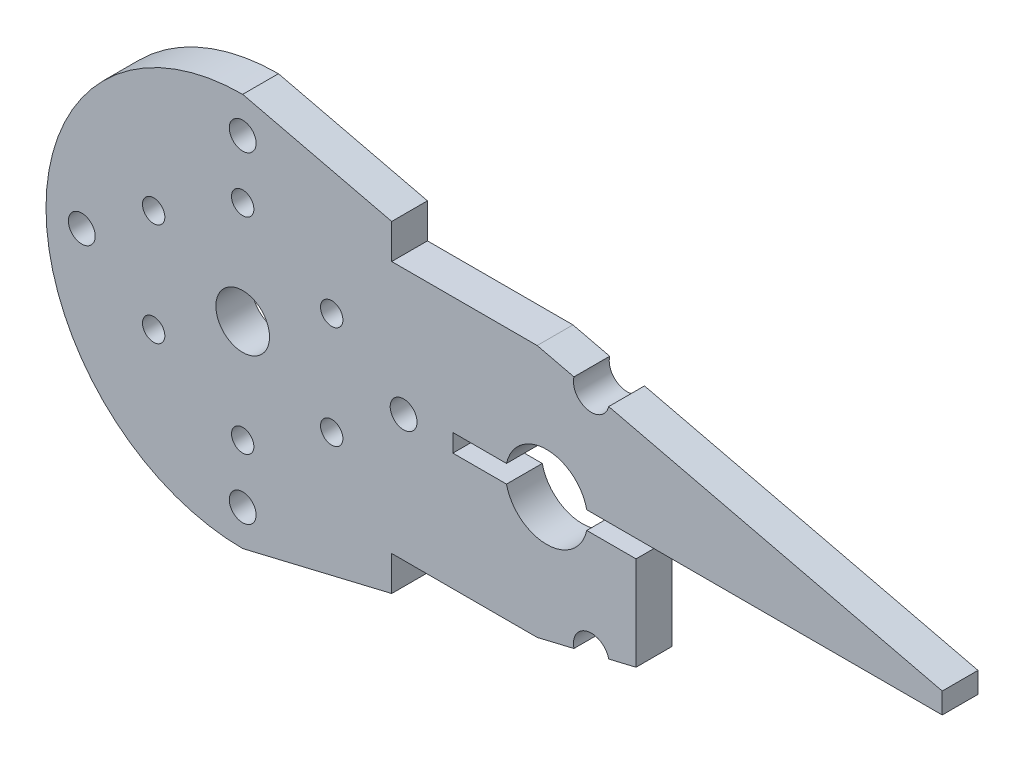
ISO-10303-21;
HEADER;
FILE_DESCRIPTION(('STEP AP214'),'2;1');
FILE_NAME('part.step','',(''),(''),'','','');
FILE_SCHEMA(('AUTOMOTIVE_DESIGN { 1 0 10303 214 1 1 1 1 }'));
ENDSEC;
DATA;
#1=APPLICATION_CONTEXT('core data for automotive mechanical design processes');
#2=APPLICATION_PROTOCOL_DEFINITION('international standard','automotive_design',2000,#1);
#3=PRODUCT_CONTEXT('',#1,'mechanical');
#4=PRODUCT('Part','Part','',(#3));
#5=PRODUCT_RELATED_PRODUCT_CATEGORY('part','',(#4));
#6=PRODUCT_DEFINITION_FORMATION('','',#4);
#7=PRODUCT_DEFINITION_CONTEXT('part definition',#1,'design');
#8=PRODUCT_DEFINITION('design','',#6,#7);
#9=PRODUCT_DEFINITION_SHAPE('','',#8);
#10=(LENGTH_UNIT() NAMED_UNIT(*) SI_UNIT(.MILLI.,.METRE.));
#11=(NAMED_UNIT(*) PLANE_ANGLE_UNIT() SI_UNIT($,.RADIAN.));
#12=(NAMED_UNIT(*) SI_UNIT($,.STERADIAN.) SOLID_ANGLE_UNIT());
#13=UNCERTAINTY_MEASURE_WITH_UNIT(LENGTH_MEASURE(1.E-05),#10,'distance_accuracy_value','');
#14=(GEOMETRIC_REPRESENTATION_CONTEXT(3) GLOBAL_UNCERTAINTY_ASSIGNED_CONTEXT((#13)) GLOBAL_UNIT_ASSIGNED_CONTEXT((#10,
#11,#12)) REPRESENTATION_CONTEXT('',''));
#15=CARTESIAN_POINT('',(0.,0.,0.));
#16=DIRECTION('',(0.,0.,1.));
#17=DIRECTION('',(1.,0.,0.));
#18=AXIS2_PLACEMENT_3D('',#15,#16,#17);
#19=CARTESIAN_POINT('',(5.00100483165142,-11.5010048316527,4.));
#20=DIRECTION('',(-0.232139621887318,0.972682474371782,0.));
#21=DIRECTION('',(-0.972682474371782,-0.232139621887318,0.));
#22=AXIS2_PLACEMENT_3D('',#19,#20,#21);
#23=PLANE('',#22);
#24=DIRECTION('',(0.972682474371782,0.232139621887318,0.));
#25=VECTOR('',#24,1.);
#26=CARTESIAN_POINT('',(5.00100483165142,-11.5010048316527,4.));
#27=LINE('',#26,#25);
#28=CARTESIAN_POINT('',(1.94536494874356,-12.2302614037938,4.));
#29=VERTEX_POINT('',#28);
#30=CARTESIAN_POINT('',(5.00100483165142,-11.5010048316527,4.));
#31=VERTEX_POINT('',#30);
#32=EDGE_CURVE('E299',#29,#31,#27,.T.);
#33=ORIENTED_EDGE('',*,*,#32,.F.);
#34=DIRECTION('',(0.,0.,-1.));
#35=VECTOR('',#34,1.);
#36=CARTESIAN_POINT('',(1.94536494874356,-12.2302614037938,4.));
#37=LINE('',#36,#35);
#38=CARTESIAN_POINT('',(1.94536494874356,-12.2302614037938,0.));
#39=VERTEX_POINT('',#38);
#40=EDGE_CURVE('E11',#29,#39,#37,.T.);
#41=ORIENTED_EDGE('',*,*,#40,.T.);
#42=DIRECTION('',(0.972682474371782,0.232139621887318,0.));
#43=VECTOR('',#42,1.);
#44=CARTESIAN_POINT('',(5.00100483165142,-11.5010048316527,0.));
#45=LINE('',#44,#43);
#46=CARTESIAN_POINT('',(5.00100483165142,-11.5010048316527,0.));
#47=VERTEX_POINT('',#46);
#48=EDGE_CURVE('E329',#39,#47,#45,.T.);
#49=ORIENTED_EDGE('',*,*,#48,.T.);
#50=DIRECTION('',(0.,0.,-1.));
#51=VECTOR('',#50,1.);
#52=CARTESIAN_POINT('',(5.00100483165142,-11.5010048316527,4.));
#53=LINE('',#52,#51);
#54=EDGE_CURVE('E387',#31,#47,#53,.T.);
#55=ORIENTED_EDGE('',*,*,#54,.F.);
#56=EDGE_LOOP('',(#33,#41,#49,#55));
#57=FACE_BOUND('',#56,.T.);
#58=ADVANCED_FACE('F35',(#57),#23,.F.);
#59=CARTESIAN_POINT('',(-6.0565833962178,-14.14,0.));
#60=VERTEX_POINT('',#59);
#61=CARTESIAN_POINT('',(-1.94536494874357,-13.158819891343,0.));
#62=VERTEX_POINT('',#61);
#63=EDGE_CURVE('E334',#60,#62,#45,.T.);
#64=ORIENTED_EDGE('',*,*,#63,.T.);
#65=DIRECTION('',(0.,0.,-1.));
#66=VECTOR('',#65,1.);
#67=CARTESIAN_POINT('',(-1.94536494874357,-13.158819891343,4.));
#68=LINE('',#67,#66);
#69=CARTESIAN_POINT('',(-1.94536494874357,-13.158819891343,4.));
#70=VERTEX_POINT('',#69);
#71=EDGE_CURVE('E43',#62,#70,#68,.F.);
#72=ORIENTED_EDGE('',*,*,#71,.T.);
#73=CARTESIAN_POINT('',(-6.0565833962178,-14.14,4.));
#74=VERTEX_POINT('',#73);
#75=EDGE_CURVE('E303',#74,#70,#27,.T.);
#76=ORIENTED_EDGE('',*,*,#75,.F.);
#77=DIRECTION('',(0.,0.,-1.));
#78=VECTOR('',#77,1.);
#79=CARTESIAN_POINT('',(-6.05658339621781,-14.14,4.));
#80=LINE('',#79,#78);
#81=EDGE_CURVE('E195',#74,#60,#80,.T.);
#82=ORIENTED_EDGE('',*,*,#81,.T.);
#83=EDGE_LOOP('',(#64,#72,#76,#82));
#84=FACE_BOUND('',#83,.T.);
#85=ADVANCED_FACE('F409',(#84),#23,.F.);
#86=CARTESIAN_POINT('',(5.00100483165142,11.5010048316527,4.));
#87=DIRECTION('',(-0.232139621887318,-0.972682474371782,0.));
#88=DIRECTION('',(0.972682474371782,-0.232139621887318,0.));
#89=AXIS2_PLACEMENT_3D('',#86,#87,#88);
#90=PLANE('',#89);
#91=DIRECTION('',(-0.972682474371782,0.232139621887318,0.));
#92=VECTOR('',#91,1.);
#93=CARTESIAN_POINT('',(5.00100483165142,11.5010048316527,4.));
#94=LINE('',#93,#92);
#95=CARTESIAN_POINT('',(-22.3298967373609,18.0237759550532,4.));
#96=VERTEX_POINT('',#95);
#97=CARTESIAN_POINT('',(-38.9989951683486,22.0020096633054,4.));
#98=VERTEX_POINT('',#97);
#99=EDGE_CURVE('E321',#96,#98,#94,.T.);
#100=ORIENTED_EDGE('',*,*,#99,.F.);
#101=DIRECTION('',(0.,0.,-1.));
#102=VECTOR('',#101,1.);
#103=CARTESIAN_POINT('',(-22.3298967373609,18.0237759550532,4.));
#104=LINE('',#103,#102);
#105=CARTESIAN_POINT('',(-22.3298967373609,18.0237759550532,0.));
#106=VERTEX_POINT('',#105);
#107=EDGE_CURVE('E402',#96,#106,#104,.T.);
#108=ORIENTED_EDGE('',*,*,#107,.T.);
#109=DIRECTION('',(-0.972682474371782,0.232139621887318,0.));
#110=VECTOR('',#109,1.);
#111=CARTESIAN_POINT('',(5.00100483165142,11.5010048316527,0.));
#112=LINE('',#111,#110);
#113=CARTESIAN_POINT('',(-38.9989951683486,22.0020096633054,0.));
#114=VERTEX_POINT('',#113);
#115=EDGE_CURVE('E354',#106,#114,#112,.T.);
#116=ORIENTED_EDGE('',*,*,#115,.T.);
#117=DIRECTION('',(0.,0.,-1.));
#118=VECTOR('',#117,1.);
#119=CARTESIAN_POINT('',(-38.9989951683486,22.0020096633054,4.));
#120=LINE('',#119,#118);
#121=EDGE_CURVE('E325',#98,#114,#120,.T.);
#122=ORIENTED_EDGE('',*,*,#121,.F.);
#123=EDGE_LOOP('',(#100,#108,#116,#122));
#124=FACE_BOUND('',#123,.T.);
#125=ADVANCED_FACE('F478',(#124),#90,.F.);
#126=CARTESIAN_POINT('',(-1.94536494874356,13.158819891343,0.));
#127=VERTEX_POINT('',#126);
#128=CARTESIAN_POINT('',(-6.0565833962178,14.14,0.));
#129=VERTEX_POINT('',#128);
#130=EDGE_CURVE('E357',#127,#129,#112,.T.);
#131=ORIENTED_EDGE('',*,*,#130,.T.);
#132=DIRECTION('',(0.,0.,1.));
#133=VECTOR('',#132,1.);
#134=CARTESIAN_POINT('',(-6.05658339621781,14.14,4.));
#135=LINE('',#134,#133);
#136=CARTESIAN_POINT('',(-6.05658339621781,14.14,4.));
#137=VERTEX_POINT('',#136);
#138=EDGE_CURVE('E399',#129,#137,#135,.T.);
#139=ORIENTED_EDGE('',*,*,#138,.T.);
#140=CARTESIAN_POINT('',(-1.94536494874356,13.158819891343,4.));
#141=VERTEX_POINT('',#140);
#142=EDGE_CURVE('E326',#141,#137,#94,.T.);
#143=ORIENTED_EDGE('',*,*,#142,.F.);
#144=DIRECTION('',(0.,0.,-1.));
#145=VECTOR('',#144,1.);
#146=CARTESIAN_POINT('',(-1.94536494874356,13.158819891343,4.));
#147=LINE('',#146,#145);
#148=EDGE_CURVE('E396',#141,#127,#147,.T.);
#149=ORIENTED_EDGE('',*,*,#148,.T.);
#150=EDGE_LOOP('',(#131,#139,#143,#149));
#151=FACE_BOUND('',#150,.T.);
#152=ADVANCED_FACE('F488',(#151),#90,.F.);
#153=CARTESIAN_POINT('',(-38.9989951683486,0.,4.));
#154=DIRECTION('',(0.,0.,1.));
#155=DIRECTION('',(1.,0.,0.));
#156=AXIS2_PLACEMENT_3D('',#153,#154,#155);
#157=PLANE('',#156);
#158=CARTESIAN_POINT('',(0.,-12.6945406475684,4.));
#159=DIRECTION('',(0.,0.,-1.));
#160=DIRECTION('',(-1.,0.,0.));
#161=AXIS2_PLACEMENT_3D('',#158,#159,#160);
#162=CIRCLE('',#161,2.);
#163=EDGE_CURVE('E50',#70,#29,#162,.T.);
#164=ORIENTED_EDGE('',*,*,#163,.T.);
#165=ORIENTED_EDGE('',*,*,#32,.T.);
#166=DIRECTION('',(0.,1.,0.));
#167=VECTOR('',#166,1.);
#168=CARTESIAN_POINT('',(5.00100483165142,-1.,4.));
#169=LINE('',#168,#167);
#170=CARTESIAN_POINT('',(5.00100483165142,-1.,4.));
#171=VERTEX_POINT('',#170);
#172=EDGE_CURVE('E302',#31,#171,#169,.T.);
#173=ORIENTED_EDGE('',*,*,#172,.T.);
#174=DIRECTION('',(-1.,0.,0.));
#175=VECTOR('',#174,1.);
#176=CARTESIAN_POINT('',(5.00100483165142,-1.,4.));
#177=LINE('',#176,#175);
#178=CARTESIAN_POINT('',(-0.509006304219855,-1.,4.));
#179=VERTEX_POINT('',#178);
#180=EDGE_CURVE('E305',#171,#179,#177,.T.);
#181=ORIENTED_EDGE('',*,*,#180,.T.);
#182=CARTESIAN_POINT('',(-4.99899516834858,0.,4.));
#183=DIRECTION('',(0.,0.,-1.));
#184=DIRECTION('',(-1.,0.,0.));
#185=AXIS2_PLACEMENT_3D('',#182,#183,#184);
#186=CIRCLE('',#185,4.6);
#187=CARTESIAN_POINT('',(-9.48898403247731,-1.,4.));
#188=VERTEX_POINT('',#187);
#189=EDGE_CURVE('E307',#179,#188,#186,.T.);
#190=ORIENTED_EDGE('',*,*,#189,.T.);
#191=DIRECTION('',(-1.,0.,0.));
#192=VECTOR('',#191,1.);
#193=CARTESIAN_POINT('',(-15.4889840324773,-1.,4.));
#194=LINE('',#193,#192);
#195=CARTESIAN_POINT('',(-15.4889840324773,-1.,4.));
#196=VERTEX_POINT('',#195);
#197=EDGE_CURVE('E309',#188,#196,#194,.T.);
#198=ORIENTED_EDGE('',*,*,#197,.T.);
#199=DIRECTION('',(0.,1.,0.));
#200=VECTOR('',#199,1.);
#201=CARTESIAN_POINT('',(-15.4889840324773,1.,4.));
#202=LINE('',#201,#200);
#203=CARTESIAN_POINT('',(-15.4889840324773,1.,4.));
#204=VERTEX_POINT('',#203);
#205=EDGE_CURVE('E311',#196,#204,#202,.T.);
#206=ORIENTED_EDGE('',*,*,#205,.T.);
#207=DIRECTION('',(1.,0.,0.));
#208=VECTOR('',#207,1.);
#209=CARTESIAN_POINT('',(-15.4889840324773,1.,4.));
#210=LINE('',#209,#208);
#211=CARTESIAN_POINT('',(-9.48898403247731,1.,4.));
#212=VERTEX_POINT('',#211);
#213=EDGE_CURVE('E313',#204,#212,#210,.T.);
#214=ORIENTED_EDGE('',*,*,#213,.T.);
#215=CARTESIAN_POINT('',(-4.99899516834858,0.,4.));
#216=DIRECTION('',(0.,0.,-1.));
#217=DIRECTION('',(1.,0.,0.));
#218=AXIS2_PLACEMENT_3D('',#215,#216,#217);
#219=CIRCLE('',#218,4.6);
#220=CARTESIAN_POINT('',(-0.509006304219855,1.,4.));
#221=VERTEX_POINT('',#220);
#222=EDGE_CURVE('E315',#212,#221,#219,.T.);
#223=ORIENTED_EDGE('',*,*,#222,.T.);
#224=DIRECTION('',(1.,0.,0.));
#225=VECTOR('',#224,1.);
#226=CARTESIAN_POINT('',(5.00100483165142,1.,4.));
#227=LINE('',#226,#225);
#228=CARTESIAN_POINT('',(39.2548128748764,1.,4.));
#229=VERTEX_POINT('',#228);
#230=EDGE_CURVE('E317',#221,#229,#227,.T.);
#231=ORIENTED_EDGE('',*,*,#230,.T.);
#232=DIRECTION('',(0.,1.,0.));
#233=VECTOR('',#232,1.);
#234=CARTESIAN_POINT('',(39.2548128748764,3.32601838246157,4.));
#235=LINE('',#234,#233);
#236=CARTESIAN_POINT('',(39.2548128748764,3.32601838246157,4.));
#237=VERTEX_POINT('',#236);
#238=EDGE_CURVE('E319',#229,#237,#235,.T.);
#239=ORIENTED_EDGE('',*,*,#238,.T.);
#240=CARTESIAN_POINT('',(1.94536494874357,12.2302614037938,4.));
#241=VERTEX_POINT('',#240);
#242=EDGE_CURVE('E322',#237,#241,#94,.T.);
#243=ORIENTED_EDGE('',*,*,#242,.T.);
#244=CARTESIAN_POINT('',(0.,12.6945406475684,4.));
#245=DIRECTION('',(0.,0.,-1.));
#246=DIRECTION('',(-1.,0.,0.));
#247=AXIS2_PLACEMENT_3D('',#244,#245,#246);
#248=CIRCLE('',#247,2.);
#249=EDGE_CURVE('E226',#241,#141,#248,.T.);
#250=ORIENTED_EDGE('',*,*,#249,.T.);
#251=ORIENTED_EDGE('',*,*,#142,.T.);
#252=DIRECTION('',(-1.,0.,0.));
#253=VECTOR('',#252,1.);
#254=CARTESIAN_POINT('',(-4.11211987717763,14.14,4.));
#255=LINE('',#254,#253);
#256=CARTESIAN_POINT('',(-22.3298967373609,14.14,4.));
#257=VERTEX_POINT('',#256);
#258=EDGE_CURVE('E215',#137,#257,#255,.T.);
#259=ORIENTED_EDGE('',*,*,#258,.T.);
#260=DIRECTION('',(0.,1.,0.));
#261=VECTOR('',#260,1.);
#262=CARTESIAN_POINT('',(-22.3298967373609,14.14,4.));
#263=LINE('',#262,#261);
#264=EDGE_CURVE('E218',#257,#96,#263,.T.);
#265=ORIENTED_EDGE('',*,*,#264,.T.);
#266=ORIENTED_EDGE('',*,*,#99,.T.);
#267=CARTESIAN_POINT('',(-38.9989951683486,0.,4.));
#268=DIRECTION('',(0.,0.,1.));
#269=DIRECTION('',(1.,0.,0.));
#270=AXIS2_PLACEMENT_3D('',#267,#268,#269);
#271=CIRCLE('',#270,22.0020096633054);
#272=CARTESIAN_POINT('',(-38.9989951683486,-22.0020096633054,4.));
#273=VERTEX_POINT('',#272);
#274=EDGE_CURVE('E297',#98,#273,#271,.T.);
#275=ORIENTED_EDGE('',*,*,#274,.T.);
#276=CARTESIAN_POINT('',(-22.3298967373609,-18.0237759550532,4.));
#277=VERTEX_POINT('',#276);
#278=EDGE_CURVE('E204',#273,#277,#27,.T.);
#279=ORIENTED_EDGE('',*,*,#278,.T.);
#280=DIRECTION('',(0.,1.,0.));
#281=VECTOR('',#280,1.);
#282=CARTESIAN_POINT('',(-22.3298967373609,-14.14,4.));
#283=LINE('',#282,#281);
#284=CARTESIAN_POINT('',(-22.3298967373609,-14.14,4.));
#285=VERTEX_POINT('',#284);
#286=EDGE_CURVE('E58',#277,#285,#283,.T.);
#287=ORIENTED_EDGE('',*,*,#286,.T.);
#288=DIRECTION('',(1.,0.,0.));
#289=VECTOR('',#288,1.);
#290=CARTESIAN_POINT('',(-4.11211987717763,-14.14,4.));
#291=LINE('',#290,#289);
#292=EDGE_CURVE('E192',#285,#74,#291,.T.);
#293=ORIENTED_EDGE('',*,*,#292,.T.);
#294=ORIENTED_EDGE('',*,*,#75,.T.);
#295=EDGE_LOOP('',(#164,#165,#173,#181,#190,#198,#206,#214,#223,#231,#239,#243,#250,#251,#259,
#265,#266,#275,#279,#287,#293,#294));
#296=FACE_BOUND('',#295,.T.);
#297=CARTESIAN_POINT('',(-57.001004831654,0.,4.));
#298=DIRECTION('',(0.,0.,1.));
#299=DIRECTION('',(1.,0.,0.));
#300=AXIS2_PLACEMENT_3D('',#297,#298,#299);
#301=CIRCLE('',#300,1.5);
#302=CARTESIAN_POINT('',(-55.501004831654,0.,4.));
#303=VERTEX_POINT('',#302);
#304=EDGE_CURVE('E237',#303,#303,#301,.T.);
#305=ORIENTED_EDGE('',*,*,#304,.F.);
#306=EDGE_LOOP('',(#305));
#307=FACE_BOUND('',#306,.T.);
#308=CARTESIAN_POINT('',(-38.9989951683486,-18.0020096633054,4.));
#309=DIRECTION('',(0.,0.,1.));
#310=DIRECTION('',(1.,0.,0.));
#311=AXIS2_PLACEMENT_3D('',#308,#309,#310);
#312=CIRCLE('',#311,1.5);
#313=CARTESIAN_POINT('',(-37.4989951683486,-18.0020096633054,4.));
#314=VERTEX_POINT('',#313);
#315=EDGE_CURVE('E249',#314,#314,#312,.T.);
#316=ORIENTED_EDGE('',*,*,#315,.F.);
#317=EDGE_LOOP('',(#316));
#318=FACE_BOUND('',#317,.T.);
#319=CARTESIAN_POINT('',(-38.9989951683486,0.,4.));
#320=DIRECTION('',(0.,0.,1.));
#321=DIRECTION('',(1.,0.,0.));
#322=AXIS2_PLACEMENT_3D('',#319,#320,#321);
#323=CIRCLE('',#322,3.);
#324=CARTESIAN_POINT('',(-35.9989951683486,0.,4.));
#325=VERTEX_POINT('',#324);
#326=EDGE_CURVE('E261',#325,#325,#323,.T.);
#327=ORIENTED_EDGE('',*,*,#326,.F.);
#328=EDGE_LOOP('',(#327));
#329=FACE_BOUND('',#328,.T.);
#330=CARTESIAN_POINT('',(-29.0397030248275,5.75000000000001,4.));
#331=DIRECTION('',(0.,0.,1.));
#332=DIRECTION('',(1.,0.,0.));
#333=AXIS2_PLACEMENT_3D('',#330,#331,#332);
#334=CIRCLE('',#333,1.25);
#335=CARTESIAN_POINT('',(-27.7897030248275,5.75000000000001,4.));
#336=VERTEX_POINT('',#335);
#337=EDGE_CURVE('E273',#336,#336,#334,.T.);
#338=ORIENTED_EDGE('',*,*,#337,.F.);
#339=EDGE_LOOP('',(#338));
#340=FACE_BOUND('',#339,.T.);
#341=CARTESIAN_POINT('',(-48.9582873118696,5.75,4.));
#342=DIRECTION('',(0.,0.,1.));
#343=DIRECTION('',(1.,0.,0.));
#344=AXIS2_PLACEMENT_3D('',#341,#342,#343);
#345=CIRCLE('',#344,1.25);
#346=CARTESIAN_POINT('',(-47.7082873118696,5.75,4.));
#347=VERTEX_POINT('',#346);
#348=EDGE_CURVE('E285',#347,#347,#345,.T.);
#349=ORIENTED_EDGE('',*,*,#348,.F.);
#350=EDGE_LOOP('',(#349));
#351=FACE_BOUND('',#350,.T.);
#352=CARTESIAN_POINT('',(-48.9582873118696,-5.75,4.));
#353=DIRECTION('',(0.,0.,1.));
#354=DIRECTION('',(1.,0.,0.));
#355=AXIS2_PLACEMENT_3D('',#352,#353,#354);
#356=CIRCLE('',#355,1.25);
#357=CARTESIAN_POINT('',(-47.7082873118696,-5.75,4.));
#358=VERTEX_POINT('',#357);
#359=EDGE_CURVE('E291',#358,#358,#356,.T.);
#360=ORIENTED_EDGE('',*,*,#359,.F.);
#361=EDGE_LOOP('',(#360));
#362=FACE_BOUND('',#361,.T.);
#363=CARTESIAN_POINT('',(-38.9989951683486,11.5,4.));
#364=DIRECTION('',(0.,0.,1.));
#365=DIRECTION('',(1.,0.,0.));
#366=AXIS2_PLACEMENT_3D('',#363,#364,#365);
#367=CIRCLE('',#366,1.25);
#368=CARTESIAN_POINT('',(-37.7489951683486,11.5,4.));
#369=VERTEX_POINT('',#368);
#370=EDGE_CURVE('E279',#369,#369,#367,.T.);
#371=ORIENTED_EDGE('',*,*,#370,.F.);
#372=EDGE_LOOP('',(#371));
#373=FACE_BOUND('',#372,.T.);
#374=CARTESIAN_POINT('',(-29.0397030248275,-5.75,4.));
#375=DIRECTION('',(0.,0.,1.));
#376=DIRECTION('',(1.,0.,0.));
#377=AXIS2_PLACEMENT_3D('',#374,#375,#376);
#378=CIRCLE('',#377,1.25);
#379=CARTESIAN_POINT('',(-27.7897030248275,-5.75,4.));
#380=VERTEX_POINT('',#379);
#381=EDGE_CURVE('E267',#380,#380,#378,.T.);
#382=ORIENTED_EDGE('',*,*,#381,.F.);
#383=EDGE_LOOP('',(#382));
#384=FACE_BOUND('',#383,.T.);
#385=CARTESIAN_POINT('',(-38.9989951683486,-11.5,4.));
#386=DIRECTION('',(0.,0.,1.));
#387=DIRECTION('',(1.,0.,0.));
#388=AXIS2_PLACEMENT_3D('',#385,#386,#387);
#389=CIRCLE('',#388,1.25);
#390=CARTESIAN_POINT('',(-37.7489951683486,-11.5,4.));
#391=VERTEX_POINT('',#390);
#392=EDGE_CURVE('E255',#391,#391,#389,.T.);
#393=ORIENTED_EDGE('',*,*,#392,.F.);
#394=EDGE_LOOP('',(#393));
#395=FACE_BOUND('',#394,.T.);
#396=CARTESIAN_POINT('',(-38.9989951683486,18.0020096633054,4.));
#397=DIRECTION('',(0.,0.,1.));
#398=DIRECTION('',(1.,0.,0.));
#399=AXIS2_PLACEMENT_3D('',#396,#397,#398);
#400=CIRCLE('',#399,1.5);
#401=CARTESIAN_POINT('',(-37.4989951683486,18.0020096633054,4.));
#402=VERTEX_POINT('',#401);
#403=EDGE_CURVE('E243',#402,#402,#400,.T.);
#404=ORIENTED_EDGE('',*,*,#403,.F.);
#405=EDGE_LOOP('',(#404));
#406=FACE_BOUND('',#405,.T.);
#407=CARTESIAN_POINT('',(-20.9969855050432,0.,4.));
#408=DIRECTION('',(0.,0.,1.));
#409=DIRECTION('',(1.,0.,0.));
#410=AXIS2_PLACEMENT_3D('',#407,#408,#409);
#411=CIRCLE('',#410,1.5);
#412=CARTESIAN_POINT('',(-19.4969855050432,0.,4.));
#413=VERTEX_POINT('',#412);
#414=EDGE_CURVE('E231',#413,#413,#411,.T.);
#415=ORIENTED_EDGE('',*,*,#414,.F.);
#416=EDGE_LOOP('',(#415));
#417=FACE_BOUND('',#416,.T.);
#418=ADVANCED_FACE('F201',(#296,#307,#318,#329,#340,#351,#362,#373,#384,#395,#406,#417),#157,.T.);
#419=CARTESIAN_POINT('',(-38.9989951683486,0.,0.));
#420=DIRECTION('',(0.,0.,1.));
#421=DIRECTION('',(1.,0.,0.));
#422=AXIS2_PLACEMENT_3D('',#419,#420,#421);
#423=PLANE('',#422);
#424=ORIENTED_EDGE('',*,*,#48,.F.);
#425=CARTESIAN_POINT('',(0.,-12.6945406475684,0.));
#426=DIRECTION('',(0.,0.,-1.));
#427=DIRECTION('',(-1.,0.,0.));
#428=AXIS2_PLACEMENT_3D('',#425,#426,#427);
#429=CIRCLE('',#428,2.);
#430=EDGE_CURVE('E212',#62,#39,#429,.T.);
#431=ORIENTED_EDGE('',*,*,#430,.F.);
#432=ORIENTED_EDGE('',*,*,#63,.F.);
#433=DIRECTION('',(1.,0.,0.));
#434=VECTOR('',#433,1.);
#435=CARTESIAN_POINT('',(-4.11211987717763,-14.14,0.));
#436=LINE('',#435,#434);
#437=CARTESIAN_POINT('',(-22.3298967373609,-14.14,0.));
#438=VERTEX_POINT('',#437);
#439=EDGE_CURVE('E207',#438,#60,#436,.T.);
#440=ORIENTED_EDGE('',*,*,#439,.F.);
#441=DIRECTION('',(0.,1.,0.));
#442=VECTOR('',#441,1.);
#443=CARTESIAN_POINT('',(-22.3298967373609,-14.14,0.));
#444=LINE('',#443,#442);
#445=CARTESIAN_POINT('',(-22.3298967373609,-18.0237759550532,0.));
#446=VERTEX_POINT('',#445);
#447=EDGE_CURVE('E186',#446,#438,#444,.T.);
#448=ORIENTED_EDGE('',*,*,#447,.F.);
#449=CARTESIAN_POINT('',(-38.9989951683486,-22.0020096633054,0.));
#450=VERTEX_POINT('',#449);
#451=EDGE_CURVE('E330',#450,#446,#45,.T.);
#452=ORIENTED_EDGE('',*,*,#451,.F.);
#453=CARTESIAN_POINT('',(-38.9989951683486,0.,0.));
#454=DIRECTION('',(0.,0.,1.));
#455=DIRECTION('',(1.,0.,0.));
#456=AXIS2_PLACEMENT_3D('',#453,#454,#455);
#457=CIRCLE('',#456,22.0020096633054);
#458=EDGE_CURVE('E294',#114,#450,#457,.T.);
#459=ORIENTED_EDGE('',*,*,#458,.F.);
#460=ORIENTED_EDGE('',*,*,#115,.F.);
#461=DIRECTION('',(0.,1.,0.));
#462=VECTOR('',#461,1.);
#463=CARTESIAN_POINT('',(-22.3298967373609,14.14,0.));
#464=LINE('',#463,#462);
#465=CARTESIAN_POINT('',(-22.3298967373609,14.14,0.));
#466=VERTEX_POINT('',#465);
#467=EDGE_CURVE('E219',#466,#106,#464,.T.);
#468=ORIENTED_EDGE('',*,*,#467,.F.);
#469=DIRECTION('',(-1.,0.,0.));
#470=VECTOR('',#469,1.);
#471=CARTESIAN_POINT('',(-4.11211987717763,14.14,0.));
#472=LINE('',#471,#470);
#473=EDGE_CURVE('E189',#129,#466,#472,.T.);
#474=ORIENTED_EDGE('',*,*,#473,.F.);
#475=ORIENTED_EDGE('',*,*,#130,.F.);
#476=CARTESIAN_POINT('',(0.,12.6945406475684,0.));
#477=DIRECTION('',(0.,0.,-1.));
#478=DIRECTION('',(-1.,0.,0.));
#479=AXIS2_PLACEMENT_3D('',#476,#477,#478);
#480=CIRCLE('',#479,2.);
#481=CARTESIAN_POINT('',(1.94536494874357,12.2302614037938,0.));
#482=VERTEX_POINT('',#481);
#483=EDGE_CURVE('E211',#482,#127,#480,.T.);
#484=ORIENTED_EDGE('',*,*,#483,.F.);
#485=CARTESIAN_POINT('',(39.2548128748764,3.32601838246157,0.));
#486=VERTEX_POINT('',#485);
#487=EDGE_CURVE('E300',#486,#482,#112,.T.);
#488=ORIENTED_EDGE('',*,*,#487,.F.);
#489=DIRECTION('',(0.,1.,0.));
#490=VECTOR('',#489,1.);
#491=CARTESIAN_POINT('',(39.2548128748764,3.32601838246157,0.));
#492=LINE('',#491,#490);
#493=CARTESIAN_POINT('',(39.2548128748764,1.,0.));
#494=VERTEX_POINT('',#493);
#495=EDGE_CURVE('E351',#494,#486,#492,.T.);
#496=ORIENTED_EDGE('',*,*,#495,.F.);
#497=DIRECTION('',(1.,0.,0.));
#498=VECTOR('',#497,1.);
#499=CARTESIAN_POINT('',(5.00100483165142,1.,0.));
#500=LINE('',#499,#498);
#501=CARTESIAN_POINT('',(-0.509006304219855,1.,0.));
#502=VERTEX_POINT('',#501);
#503=EDGE_CURVE('E349',#502,#494,#500,.T.);
#504=ORIENTED_EDGE('',*,*,#503,.F.);
#505=CARTESIAN_POINT('',(-4.99899516834858,0.,0.));
#506=DIRECTION('',(0.,0.,-1.));
#507=DIRECTION('',(1.,0.,0.));
#508=AXIS2_PLACEMENT_3D('',#505,#506,#507);
#509=CIRCLE('',#508,4.6);
#510=CARTESIAN_POINT('',(-9.48898403247731,1.,0.));
#511=VERTEX_POINT('',#510);
#512=EDGE_CURVE('E346',#511,#502,#509,.T.);
#513=ORIENTED_EDGE('',*,*,#512,.F.);
#514=DIRECTION('',(1.,0.,0.));
#515=VECTOR('',#514,1.);
#516=CARTESIAN_POINT('',(-15.4889840324773,1.,0.));
#517=LINE('',#516,#515);
#518=CARTESIAN_POINT('',(-15.4889840324773,1.,0.));
#519=VERTEX_POINT('',#518);
#520=EDGE_CURVE('E344',#519,#511,#517,.T.);
#521=ORIENTED_EDGE('',*,*,#520,.F.);
#522=DIRECTION('',(0.,1.,0.));
#523=VECTOR('',#522,1.);
#524=CARTESIAN_POINT('',(-15.4889840324773,1.,0.));
#525=LINE('',#524,#523);
#526=CARTESIAN_POINT('',(-15.4889840324773,-1.,0.));
#527=VERTEX_POINT('',#526);
#528=EDGE_CURVE('E342',#527,#519,#525,.T.);
#529=ORIENTED_EDGE('',*,*,#528,.F.);
#530=DIRECTION('',(-1.,0.,0.));
#531=VECTOR('',#530,1.);
#532=CARTESIAN_POINT('',(-15.4889840324773,-1.,0.));
#533=LINE('',#532,#531);
#534=CARTESIAN_POINT('',(-9.48898403247731,-1.,0.));
#535=VERTEX_POINT('',#534);
#536=EDGE_CURVE('E340',#535,#527,#533,.T.);
#537=ORIENTED_EDGE('',*,*,#536,.F.);
#538=CARTESIAN_POINT('',(-4.99899516834858,0.,0.));
#539=DIRECTION('',(0.,0.,-1.));
#540=DIRECTION('',(-1.,0.,0.));
#541=AXIS2_PLACEMENT_3D('',#538,#539,#540);
#542=CIRCLE('',#541,4.6);
#543=CARTESIAN_POINT('',(-0.509006304219855,-1.,0.));
#544=VERTEX_POINT('',#543);
#545=EDGE_CURVE('E338',#544,#535,#542,.T.);
#546=ORIENTED_EDGE('',*,*,#545,.F.);
#547=DIRECTION('',(-1.,0.,0.));
#548=VECTOR('',#547,1.);
#549=CARTESIAN_POINT('',(5.00100483165142,-1.,0.));
#550=LINE('',#549,#548);
#551=CARTESIAN_POINT('',(5.00100483165142,-1.,0.));
#552=VERTEX_POINT('',#551);
#553=EDGE_CURVE('E336',#552,#544,#550,.T.);
#554=ORIENTED_EDGE('',*,*,#553,.F.);
#555=DIRECTION('',(0.,1.,0.));
#556=VECTOR('',#555,1.);
#557=CARTESIAN_POINT('',(5.00100483165142,-1.,0.));
#558=LINE('',#557,#556);
#559=EDGE_CURVE('E333',#47,#552,#558,.T.);
#560=ORIENTED_EDGE('',*,*,#559,.F.);
#561=EDGE_LOOP('',(#424,#431,#432,#440,#448,#452,#459,#460,#468,#474,#475,#484,#488,#496,#504,
#513,#521,#529,#537,#546,#554,#560));
#562=FACE_BOUND('',#561,.T.);
#563=CARTESIAN_POINT('',(-48.9582873118696,-5.75,0.));
#564=DIRECTION('',(0.,0.,1.));
#565=DIRECTION('',(1.,0.,0.));
#566=AXIS2_PLACEMENT_3D('',#563,#564,#565);
#567=CIRCLE('',#566,1.25);
#568=CARTESIAN_POINT('',(-47.7082873118696,-5.75,0.));
#569=VERTEX_POINT('',#568);
#570=EDGE_CURVE('E288',#569,#569,#567,.T.);
#571=ORIENTED_EDGE('',*,*,#570,.T.);
#572=EDGE_LOOP('',(#571));
#573=FACE_BOUND('',#572,.T.);
#574=CARTESIAN_POINT('',(-48.9582873118696,5.75,0.));
#575=DIRECTION('',(0.,0.,1.));
#576=DIRECTION('',(1.,0.,0.));
#577=AXIS2_PLACEMENT_3D('',#574,#575,#576);
#578=CIRCLE('',#577,1.25);
#579=CARTESIAN_POINT('',(-47.7082873118696,5.75,0.));
#580=VERTEX_POINT('',#579);
#581=EDGE_CURVE('E282',#580,#580,#578,.T.);
#582=ORIENTED_EDGE('',*,*,#581,.T.);
#583=EDGE_LOOP('',(#582));
#584=FACE_BOUND('',#583,.T.);
#585=CARTESIAN_POINT('',(-38.9989951683486,11.5,0.));
#586=DIRECTION('',(0.,0.,1.));
#587=DIRECTION('',(1.,0.,0.));
#588=AXIS2_PLACEMENT_3D('',#585,#586,#587);
#589=CIRCLE('',#588,1.25);
#590=CARTESIAN_POINT('',(-37.7489951683486,11.5,0.));
#591=VERTEX_POINT('',#590);
#592=EDGE_CURVE('E276',#591,#591,#589,.T.);
#593=ORIENTED_EDGE('',*,*,#592,.T.);
#594=EDGE_LOOP('',(#593));
#595=FACE_BOUND('',#594,.T.);
#596=CARTESIAN_POINT('',(-29.0397030248275,5.75000000000001,0.));
#597=DIRECTION('',(0.,0.,1.));
#598=DIRECTION('',(1.,0.,0.));
#599=AXIS2_PLACEMENT_3D('',#596,#597,#598);
#600=CIRCLE('',#599,1.25);
#601=CARTESIAN_POINT('',(-27.7897030248275,5.75000000000001,0.));
#602=VERTEX_POINT('',#601);
#603=EDGE_CURVE('E270',#602,#602,#600,.T.);
#604=ORIENTED_EDGE('',*,*,#603,.T.);
#605=EDGE_LOOP('',(#604));
#606=FACE_BOUND('',#605,.T.);
#607=CARTESIAN_POINT('',(-29.0397030248275,-5.75,0.));
#608=DIRECTION('',(0.,0.,1.));
#609=DIRECTION('',(1.,0.,0.));
#610=AXIS2_PLACEMENT_3D('',#607,#608,#609);
#611=CIRCLE('',#610,1.25);
#612=CARTESIAN_POINT('',(-27.7897030248275,-5.75,0.));
#613=VERTEX_POINT('',#612);
#614=EDGE_CURVE('E264',#613,#613,#611,.T.);
#615=ORIENTED_EDGE('',*,*,#614,.T.);
#616=EDGE_LOOP('',(#615));
#617=FACE_BOUND('',#616,.T.);
#618=CARTESIAN_POINT('',(-38.9989951683486,0.,0.));
#619=DIRECTION('',(0.,0.,1.));
#620=DIRECTION('',(1.,0.,0.));
#621=AXIS2_PLACEMENT_3D('',#618,#619,#620);
#622=CIRCLE('',#621,3.);
#623=CARTESIAN_POINT('',(-35.9989951683486,0.,0.));
#624=VERTEX_POINT('',#623);
#625=EDGE_CURVE('E258',#624,#624,#622,.T.);
#626=ORIENTED_EDGE('',*,*,#625,.T.);
#627=EDGE_LOOP('',(#626));
#628=FACE_BOUND('',#627,.T.);
#629=CARTESIAN_POINT('',(-38.9989951683486,-11.5,0.));
#630=DIRECTION('',(0.,0.,1.));
#631=DIRECTION('',(1.,0.,0.));
#632=AXIS2_PLACEMENT_3D('',#629,#630,#631);
#633=CIRCLE('',#632,1.25);
#634=CARTESIAN_POINT('',(-37.7489951683486,-11.5,0.));
#635=VERTEX_POINT('',#634);
#636=EDGE_CURVE('E252',#635,#635,#633,.T.);
#637=ORIENTED_EDGE('',*,*,#636,.T.);
#638=EDGE_LOOP('',(#637));
#639=FACE_BOUND('',#638,.T.);
#640=CARTESIAN_POINT('',(-38.9989951683486,-18.0020096633054,0.));
#641=DIRECTION('',(0.,0.,1.));
#642=DIRECTION('',(1.,0.,0.));
#643=AXIS2_PLACEMENT_3D('',#640,#641,#642);
#644=CIRCLE('',#643,1.5);
#645=CARTESIAN_POINT('',(-37.4989951683486,-18.0020096633054,0.));
#646=VERTEX_POINT('',#645);
#647=EDGE_CURVE('E246',#646,#646,#644,.T.);
#648=ORIENTED_EDGE('',*,*,#647,.T.);
#649=EDGE_LOOP('',(#648));
#650=FACE_BOUND('',#649,.T.);
#651=CARTESIAN_POINT('',(-38.9989951683486,18.0020096633054,0.));
#652=DIRECTION('',(0.,0.,1.));
#653=DIRECTION('',(1.,0.,0.));
#654=AXIS2_PLACEMENT_3D('',#651,#652,#653);
#655=CIRCLE('',#654,1.5);
#656=CARTESIAN_POINT('',(-37.4989951683486,18.0020096633054,0.));
#657=VERTEX_POINT('',#656);
#658=EDGE_CURVE('E240',#657,#657,#655,.T.);
#659=ORIENTED_EDGE('',*,*,#658,.T.);
#660=EDGE_LOOP('',(#659));
#661=FACE_BOUND('',#660,.T.);
#662=CARTESIAN_POINT('',(-57.001004831654,0.,0.));
#663=DIRECTION('',(0.,0.,1.));
#664=DIRECTION('',(1.,0.,0.));
#665=AXIS2_PLACEMENT_3D('',#662,#663,#664);
#666=CIRCLE('',#665,1.5);
#667=CARTESIAN_POINT('',(-55.501004831654,0.,0.));
#668=VERTEX_POINT('',#667);
#669=EDGE_CURVE('E234',#668,#668,#666,.T.);
#670=ORIENTED_EDGE('',*,*,#669,.T.);
#671=EDGE_LOOP('',(#670));
#672=FACE_BOUND('',#671,.T.);
#673=CARTESIAN_POINT('',(-20.9969855050432,0.,0.));
#674=DIRECTION('',(0.,0.,1.));
#675=DIRECTION('',(1.,0.,0.));
#676=AXIS2_PLACEMENT_3D('',#673,#674,#675);
#677=CIRCLE('',#676,1.5);
#678=CARTESIAN_POINT('',(-19.4969855050432,0.,0.));
#679=VERTEX_POINT('',#678);
#680=EDGE_CURVE('E229',#679,#679,#677,.T.);
#681=ORIENTED_EDGE('',*,*,#680,.T.);
#682=EDGE_LOOP('',(#681));
#683=FACE_BOUND('',#682,.T.);
#684=ADVANCED_FACE('F468',(#562,#573,#584,#595,#606,#617,#628,#639,#650,#661,#672,#683),#423,.F.);
#685=CARTESIAN_POINT('',(-38.9989951683486,0.,4.));
#686=DIRECTION('',(0.,0.,-1.));
#687=DIRECTION('',(-1.,0.,0.));
#688=AXIS2_PLACEMENT_3D('',#685,#686,#687);
#689=CYLINDRICAL_SURFACE('',#688,22.0020096633054);
#690=ORIENTED_EDGE('',*,*,#458,.T.);
#691=DIRECTION('',(0.,0.,-1.));
#692=VECTOR('',#691,1.);
#693=CARTESIAN_POINT('',(-38.9989951683486,-22.0020096633054,4.));
#694=LINE('',#693,#692);
#695=EDGE_CURVE('E390',#273,#450,#694,.T.);
#696=ORIENTED_EDGE('',*,*,#695,.F.);
#697=ORIENTED_EDGE('',*,*,#274,.F.);
#698=ORIENTED_EDGE('',*,*,#121,.T.);
#699=EDGE_LOOP('',(#690,#696,#697,#698));
#700=FACE_BOUND('',#699,.T.);
#701=ADVANCED_FACE('F37',(#700),#689,.T.);
#702=ORIENTED_EDGE('',*,*,#451,.T.);
#703=DIRECTION('',(0.,0.,1.));
#704=VECTOR('',#703,1.);
#705=CARTESIAN_POINT('',(-22.3298967373609,-18.0237759550532,4.));
#706=LINE('',#705,#704);
#707=EDGE_CURVE('E405',#446,#277,#706,.T.);
#708=ORIENTED_EDGE('',*,*,#707,.T.);
#709=ORIENTED_EDGE('',*,*,#278,.F.);
#710=ORIENTED_EDGE('',*,*,#695,.T.);
#711=EDGE_LOOP('',(#702,#708,#709,#710));
#712=FACE_BOUND('',#711,.T.);
#713=ADVANCED_FACE('F484',(#712),#23,.F.);
#714=CARTESIAN_POINT('',(5.00100483165142,-1.,4.));
#715=DIRECTION('',(-1.,0.,0.));
#716=DIRECTION('',(0.,0.,1.));
#717=AXIS2_PLACEMENT_3D('',#714,#715,#716);
#718=PLANE('',#717);
#719=ORIENTED_EDGE('',*,*,#559,.T.);
#720=DIRECTION('',(0.,0.,-1.));
#721=VECTOR('',#720,1.);
#722=CARTESIAN_POINT('',(5.00100483165142,-1.,4.));
#723=LINE('',#722,#721);
#724=EDGE_CURVE('E384',#171,#552,#723,.T.);
#725=ORIENTED_EDGE('',*,*,#724,.F.);
#726=ORIENTED_EDGE('',*,*,#172,.F.);
#727=ORIENTED_EDGE('',*,*,#54,.T.);
#728=EDGE_LOOP('',(#719,#725,#726,#727));
#729=FACE_BOUND('',#728,.T.);
#730=ADVANCED_FACE('F420',(#729),#718,.F.);
#731=CARTESIAN_POINT('',(5.00100483165142,-1.,4.));
#732=DIRECTION('',(0.,-1.,0.));
#733=DIRECTION('',(0.,0.,-1.));
#734=AXIS2_PLACEMENT_3D('',#731,#732,#733);
#735=PLANE('',#734);
#736=ORIENTED_EDGE('',*,*,#553,.T.);
#737=DIRECTION('',(0.,0.,-1.));
#738=VECTOR('',#737,1.);
#739=CARTESIAN_POINT('',(-0.509006304219855,-1.,4.));
#740=LINE('',#739,#738);
#741=EDGE_CURVE('E381',#179,#544,#740,.T.);
#742=ORIENTED_EDGE('',*,*,#741,.F.);
#743=ORIENTED_EDGE('',*,*,#180,.F.);
#744=ORIENTED_EDGE('',*,*,#724,.T.);
#745=EDGE_LOOP('',(#736,#742,#743,#744));
#746=FACE_BOUND('',#745,.T.);
#747=ADVANCED_FACE('F425',(#746),#735,.F.);
#748=CARTESIAN_POINT('',(-4.99899516834858,0.,4.));
#749=DIRECTION('',(0.,0.,-1.));
#750=DIRECTION('',(-1.,0.,0.));
#751=AXIS2_PLACEMENT_3D('',#748,#749,#750);
#752=CYLINDRICAL_SURFACE('',#751,4.6);
#753=ORIENTED_EDGE('',*,*,#545,.T.);
#754=DIRECTION('',(0.,0.,-1.));
#755=VECTOR('',#754,1.);
#756=CARTESIAN_POINT('',(-9.48898403247731,-1.,4.));
#757=LINE('',#756,#755);
#758=EDGE_CURVE('E378',#188,#535,#757,.T.);
#759=ORIENTED_EDGE('',*,*,#758,.F.);
#760=ORIENTED_EDGE('',*,*,#189,.F.);
#761=ORIENTED_EDGE('',*,*,#741,.T.);
#762=EDGE_LOOP('',(#753,#759,#760,#761));
#763=FACE_BOUND('',#762,.T.);
#764=ADVANCED_FACE('F431',(#763),#752,.F.);
#765=CARTESIAN_POINT('',(-15.4889840324773,-1.,4.));
#766=DIRECTION('',(0.,-1.,0.));
#767=DIRECTION('',(0.,0.,-1.));
#768=AXIS2_PLACEMENT_3D('',#765,#766,#767);
#769=PLANE('',#768);
#770=ORIENTED_EDGE('',*,*,#536,.T.);
#771=DIRECTION('',(0.,0.,-1.));
#772=VECTOR('',#771,1.);
#773=CARTESIAN_POINT('',(-15.4889840324773,-1.,4.));
#774=LINE('',#773,#772);
#775=EDGE_CURVE('E375',#196,#527,#774,.T.);
#776=ORIENTED_EDGE('',*,*,#775,.F.);
#777=ORIENTED_EDGE('',*,*,#197,.F.);
#778=ORIENTED_EDGE('',*,*,#758,.T.);
#779=EDGE_LOOP('',(#770,#776,#777,#778));
#780=FACE_BOUND('',#779,.T.);
#781=ADVANCED_FACE('F435',(#780),#769,.F.);
#782=CARTESIAN_POINT('',(-15.4889840324773,1.,4.));
#783=DIRECTION('',(-1.,0.,0.));
#784=DIRECTION('',(0.,0.,1.));
#785=AXIS2_PLACEMENT_3D('',#782,#783,#784);
#786=PLANE('',#785);
#787=ORIENTED_EDGE('',*,*,#528,.T.);
#788=DIRECTION('',(0.,0.,-1.));
#789=VECTOR('',#788,1.);
#790=CARTESIAN_POINT('',(-15.4889840324773,1.,4.));
#791=LINE('',#790,#789);
#792=EDGE_CURVE('E372',#204,#519,#791,.T.);
#793=ORIENTED_EDGE('',*,*,#792,.F.);
#794=ORIENTED_EDGE('',*,*,#205,.F.);
#795=ORIENTED_EDGE('',*,*,#775,.T.);
#796=EDGE_LOOP('',(#787,#793,#794,#795));
#797=FACE_BOUND('',#796,.T.);
#798=ADVANCED_FACE('F440',(#797),#786,.F.);
#799=CARTESIAN_POINT('',(-15.4889840324773,1.,4.));
#800=DIRECTION('',(0.,1.,0.));
#801=DIRECTION('',(0.,0.,1.));
#802=AXIS2_PLACEMENT_3D('',#799,#800,#801);
#803=PLANE('',#802);
#804=ORIENTED_EDGE('',*,*,#520,.T.);
#805=DIRECTION('',(0.,0.,-1.));
#806=VECTOR('',#805,1.);
#807=CARTESIAN_POINT('',(-9.48898403247731,1.,4.));
#808=LINE('',#807,#806);
#809=EDGE_CURVE('E369',#212,#511,#808,.T.);
#810=ORIENTED_EDGE('',*,*,#809,.F.);
#811=ORIENTED_EDGE('',*,*,#213,.F.);
#812=ORIENTED_EDGE('',*,*,#792,.T.);
#813=EDGE_LOOP('',(#804,#810,#811,#812));
#814=FACE_BOUND('',#813,.T.);
#815=ADVANCED_FACE('F446',(#814),#803,.F.);
#816=CARTESIAN_POINT('',(-4.99899516834858,0.,4.));
#817=DIRECTION('',(0.,0.,-1.));
#818=DIRECTION('',(-1.,0.,0.));
#819=AXIS2_PLACEMENT_3D('',#816,#817,#818);
#820=CYLINDRICAL_SURFACE('',#819,4.6);
#821=ORIENTED_EDGE('',*,*,#512,.T.);
#822=DIRECTION('',(0.,0.,-1.));
#823=VECTOR('',#822,1.);
#824=CARTESIAN_POINT('',(-0.509006304219855,1.,4.));
#825=LINE('',#824,#823);
#826=EDGE_CURVE('E366',#221,#502,#825,.T.);
#827=ORIENTED_EDGE('',*,*,#826,.F.);
#828=ORIENTED_EDGE('',*,*,#222,.F.);
#829=ORIENTED_EDGE('',*,*,#809,.T.);
#830=EDGE_LOOP('',(#821,#827,#828,#829));
#831=FACE_BOUND('',#830,.T.);
#832=ADVANCED_FACE('F450',(#831),#820,.F.);
#833=CARTESIAN_POINT('',(5.00100483165142,1.,4.));
#834=DIRECTION('',(0.,1.,0.));
#835=DIRECTION('',(0.,0.,1.));
#836=AXIS2_PLACEMENT_3D('',#833,#834,#835);
#837=PLANE('',#836);
#838=ORIENTED_EDGE('',*,*,#503,.T.);
#839=DIRECTION('',(0.,0.,-1.));
#840=VECTOR('',#839,1.);
#841=CARTESIAN_POINT('',(39.2548128748764,1.,4.));
#842=LINE('',#841,#840);
#843=EDGE_CURVE('E363',#229,#494,#842,.T.);
#844=ORIENTED_EDGE('',*,*,#843,.F.);
#845=ORIENTED_EDGE('',*,*,#230,.F.);
#846=ORIENTED_EDGE('',*,*,#826,.T.);
#847=EDGE_LOOP('',(#838,#844,#845,#846));
#848=FACE_BOUND('',#847,.T.);
#849=ADVANCED_FACE('F454',(#848),#837,.F.);
#850=CARTESIAN_POINT('',(39.2548128748764,3.32601838246157,4.));
#851=DIRECTION('',(-1.,0.,0.));
#852=DIRECTION('',(0.,0.,1.));
#853=AXIS2_PLACEMENT_3D('',#850,#851,#852);
#854=PLANE('',#853);
#855=ORIENTED_EDGE('',*,*,#495,.T.);
#856=DIRECTION('',(0.,0.,-1.));
#857=VECTOR('',#856,1.);
#858=CARTESIAN_POINT('',(39.2548128748764,3.32601838246157,4.));
#859=LINE('',#858,#857);
#860=EDGE_CURVE('E360',#237,#486,#859,.T.);
#861=ORIENTED_EDGE('',*,*,#860,.F.);
#862=ORIENTED_EDGE('',*,*,#238,.F.);
#863=ORIENTED_EDGE('',*,*,#843,.T.);
#864=EDGE_LOOP('',(#855,#861,#862,#863));
#865=FACE_BOUND('',#864,.T.);
#866=ADVANCED_FACE('F459',(#865),#854,.F.);
#867=ORIENTED_EDGE('',*,*,#487,.T.);
#868=DIRECTION('',(0.,0.,-1.));
#869=VECTOR('',#868,1.);
#870=CARTESIAN_POINT('',(1.94536494874357,12.2302614037938,4.));
#871=LINE('',#870,#869);
#872=EDGE_CURVE('E393',#482,#241,#871,.F.);
#873=ORIENTED_EDGE('',*,*,#872,.T.);
#874=ORIENTED_EDGE('',*,*,#242,.F.);
#875=ORIENTED_EDGE('',*,*,#860,.T.);
#876=EDGE_LOOP('',(#867,#873,#874,#875));
#877=FACE_BOUND('',#876,.T.);
#878=ADVANCED_FACE('F462',(#877),#90,.F.);
#879=CARTESIAN_POINT('',(-48.9582873118696,-5.75,4.));
#880=DIRECTION('',(0.,0.,-1.));
#881=DIRECTION('',(-1.,0.,0.));
#882=AXIS2_PLACEMENT_3D('',#879,#880,#881);
#883=CYLINDRICAL_SURFACE('',#882,1.25);
#884=ORIENTED_EDGE('',*,*,#359,.T.);
#885=EDGE_LOOP('',(#884));
#886=FACE_BOUND('',#885,.T.);
#887=ORIENTED_EDGE('',*,*,#570,.F.);
#888=EDGE_LOOP('',(#887));
#889=FACE_BOUND('',#888,.T.);
#890=ADVANCED_FACE('F525',(#886,#889),#883,.F.);
#891=CARTESIAN_POINT('',(-48.9582873118696,5.75,4.));
#892=DIRECTION('',(0.,0.,-1.));
#893=DIRECTION('',(-1.,0.,0.));
#894=AXIS2_PLACEMENT_3D('',#891,#892,#893);
#895=CYLINDRICAL_SURFACE('',#894,1.25);
#896=ORIENTED_EDGE('',*,*,#348,.T.);
#897=EDGE_LOOP('',(#896));
#898=FACE_BOUND('',#897,.T.);
#899=ORIENTED_EDGE('',*,*,#581,.F.);
#900=EDGE_LOOP('',(#899));
#901=FACE_BOUND('',#900,.T.);
#902=ADVANCED_FACE('F584',(#898,#901),#895,.F.);
#903=CARTESIAN_POINT('',(-38.9989951683486,11.5,4.));
#904=DIRECTION('',(0.,0.,-1.));
#905=DIRECTION('',(-1.,0.,0.));
#906=AXIS2_PLACEMENT_3D('',#903,#904,#905);
#907=CYLINDRICAL_SURFACE('',#906,1.25);
#908=ORIENTED_EDGE('',*,*,#370,.T.);
#909=EDGE_LOOP('',(#908));
#910=FACE_BOUND('',#909,.T.);
#911=ORIENTED_EDGE('',*,*,#592,.F.);
#912=EDGE_LOOP('',(#911));
#913=FACE_BOUND('',#912,.T.);
#914=ADVANCED_FACE('F591',(#910,#913),#907,.F.);
#915=CARTESIAN_POINT('',(-29.0397030248275,5.75000000000001,4.));
#916=DIRECTION('',(0.,0.,-1.));
#917=DIRECTION('',(-1.,0.,0.));
#918=AXIS2_PLACEMENT_3D('',#915,#916,#917);
#919=CYLINDRICAL_SURFACE('',#918,1.25);
#920=ORIENTED_EDGE('',*,*,#337,.T.);
#921=EDGE_LOOP('',(#920));
#922=FACE_BOUND('',#921,.T.);
#923=ORIENTED_EDGE('',*,*,#603,.F.);
#924=EDGE_LOOP('',(#923));
#925=FACE_BOUND('',#924,.T.);
#926=ADVANCED_FACE('F599',(#922,#925),#919,.F.);
#927=CARTESIAN_POINT('',(-29.0397030248275,-5.75,4.));
#928=DIRECTION('',(0.,0.,-1.));
#929=DIRECTION('',(-1.,0.,0.));
#930=AXIS2_PLACEMENT_3D('',#927,#928,#929);
#931=CYLINDRICAL_SURFACE('',#930,1.25);
#932=ORIENTED_EDGE('',*,*,#381,.T.);
#933=EDGE_LOOP('',(#932));
#934=FACE_BOUND('',#933,.T.);
#935=ORIENTED_EDGE('',*,*,#614,.F.);
#936=EDGE_LOOP('',(#935));
#937=FACE_BOUND('',#936,.T.);
#938=ADVANCED_FACE('F607',(#934,#937),#931,.F.);
#939=CARTESIAN_POINT('',(-38.9989951683486,0.,4.));
#940=DIRECTION('',(0.,0.,-1.));
#941=DIRECTION('',(-1.,0.,0.));
#942=AXIS2_PLACEMENT_3D('',#939,#940,#941);
#943=CYLINDRICAL_SURFACE('',#942,3.);
#944=ORIENTED_EDGE('',*,*,#326,.T.);
#945=EDGE_LOOP('',(#944));
#946=FACE_BOUND('',#945,.T.);
#947=ORIENTED_EDGE('',*,*,#625,.F.);
#948=EDGE_LOOP('',(#947));
#949=FACE_BOUND('',#948,.T.);
#950=ADVANCED_FACE('F615',(#946,#949),#943,.F.);
#951=CARTESIAN_POINT('',(-38.9989951683486,-11.5,4.));
#952=DIRECTION('',(0.,0.,-1.));
#953=DIRECTION('',(-1.,0.,0.));
#954=AXIS2_PLACEMENT_3D('',#951,#952,#953);
#955=CYLINDRICAL_SURFACE('',#954,1.25);
#956=ORIENTED_EDGE('',*,*,#392,.T.);
#957=EDGE_LOOP('',(#956));
#958=FACE_BOUND('',#957,.T.);
#959=ORIENTED_EDGE('',*,*,#636,.F.);
#960=EDGE_LOOP('',(#959));
#961=FACE_BOUND('',#960,.T.);
#962=ADVANCED_FACE('F623',(#958,#961),#955,.F.);
#963=CARTESIAN_POINT('',(-38.9989951683486,-18.0020096633054,4.));
#964=DIRECTION('',(0.,0.,-1.));
#965=DIRECTION('',(-1.,0.,0.));
#966=AXIS2_PLACEMENT_3D('',#963,#964,#965);
#967=CYLINDRICAL_SURFACE('',#966,1.5);
#968=ORIENTED_EDGE('',*,*,#315,.T.);
#969=EDGE_LOOP('',(#968));
#970=FACE_BOUND('',#969,.T.);
#971=ORIENTED_EDGE('',*,*,#647,.F.);
#972=EDGE_LOOP('',(#971));
#973=FACE_BOUND('',#972,.T.);
#974=ADVANCED_FACE('F631',(#970,#973),#967,.F.);
#975=CARTESIAN_POINT('',(-38.9989951683486,18.0020096633054,4.));
#976=DIRECTION('',(0.,0.,-1.));
#977=DIRECTION('',(-1.,0.,0.));
#978=AXIS2_PLACEMENT_3D('',#975,#976,#977);
#979=CYLINDRICAL_SURFACE('',#978,1.5);
#980=ORIENTED_EDGE('',*,*,#403,.T.);
#981=EDGE_LOOP('',(#980));
#982=FACE_BOUND('',#981,.T.);
#983=ORIENTED_EDGE('',*,*,#658,.F.);
#984=EDGE_LOOP('',(#983));
#985=FACE_BOUND('',#984,.T.);
#986=ADVANCED_FACE('F639',(#982,#985),#979,.F.);
#987=CARTESIAN_POINT('',(-57.001004831654,0.,4.));
#988=DIRECTION('',(0.,0.,-1.));
#989=DIRECTION('',(-1.,0.,0.));
#990=AXIS2_PLACEMENT_3D('',#987,#988,#989);
#991=CYLINDRICAL_SURFACE('',#990,1.5);
#992=ORIENTED_EDGE('',*,*,#304,.T.);
#993=EDGE_LOOP('',(#992));
#994=FACE_BOUND('',#993,.T.);
#995=ORIENTED_EDGE('',*,*,#669,.F.);
#996=EDGE_LOOP('',(#995));
#997=FACE_BOUND('',#996,.T.);
#998=ADVANCED_FACE('F647',(#994,#997),#991,.F.);
#999=CARTESIAN_POINT('',(-20.9969855050432,0.,4.));
#1000=DIRECTION('',(0.,0.,-1.));
#1001=DIRECTION('',(-1.,0.,0.));
#1002=AXIS2_PLACEMENT_3D('',#999,#1000,#1001);
#1003=CYLINDRICAL_SURFACE('',#1002,1.5);
#1004=ORIENTED_EDGE('',*,*,#414,.T.);
#1005=EDGE_LOOP('',(#1004));
#1006=FACE_BOUND('',#1005,.T.);
#1007=ORIENTED_EDGE('',*,*,#680,.F.);
#1008=EDGE_LOOP('',(#1007));
#1009=FACE_BOUND('',#1008,.T.);
#1010=ADVANCED_FACE('F500',(#1006,#1009),#1003,.F.);
#1011=CARTESIAN_POINT('',(0.,12.6945406475684,4.));
#1012=DIRECTION('',(0.,0.,-1.));
#1013=DIRECTION('',(-1.,0.,0.));
#1014=AXIS2_PLACEMENT_3D('',#1011,#1012,#1013);
#1015=CYLINDRICAL_SURFACE('',#1014,2.);
#1016=ORIENTED_EDGE('',*,*,#249,.F.);
#1017=ORIENTED_EDGE('',*,*,#872,.F.);
#1018=ORIENTED_EDGE('',*,*,#483,.T.);
#1019=ORIENTED_EDGE('',*,*,#148,.F.);
#1020=EDGE_LOOP('',(#1016,#1017,#1018,#1019));
#1021=FACE_BOUND('',#1020,.T.);
#1022=ADVANCED_FACE('F465',(#1021),#1015,.F.);
#1023=CARTESIAN_POINT('',(-22.3298967373609,14.14,4.));
#1024=DIRECTION('',(-1.,0.,0.));
#1025=DIRECTION('',(0.,0.,1.));
#1026=AXIS2_PLACEMENT_3D('',#1023,#1024,#1025);
#1027=PLANE('',#1026);
#1028=ORIENTED_EDGE('',*,*,#264,.F.);
#1029=DIRECTION('',(0.,0.,-1.));
#1030=VECTOR('',#1029,1.);
#1031=CARTESIAN_POINT('',(-22.3298967373609,14.14,4.));
#1032=LINE('',#1031,#1030);
#1033=EDGE_CURVE('E214',#257,#466,#1032,.T.);
#1034=ORIENTED_EDGE('',*,*,#1033,.T.);
#1035=ORIENTED_EDGE('',*,*,#467,.T.);
#1036=ORIENTED_EDGE('',*,*,#107,.F.);
#1037=EDGE_LOOP('',(#1028,#1034,#1035,#1036));
#1038=FACE_BOUND('',#1037,.T.);
#1039=ADVANCED_FACE('F492',(#1038),#1027,.F.);
#1040=CARTESIAN_POINT('',(-4.11211987717763,14.14,4.));
#1041=DIRECTION('',(0.,-1.,0.));
#1042=DIRECTION('',(0.,0.,-1.));
#1043=AXIS2_PLACEMENT_3D('',#1040,#1041,#1042);
#1044=PLANE('',#1043);
#1045=ORIENTED_EDGE('',*,*,#473,.T.);
#1046=ORIENTED_EDGE('',*,*,#1033,.F.);
#1047=ORIENTED_EDGE('',*,*,#258,.F.);
#1048=ORIENTED_EDGE('',*,*,#138,.F.);
#1049=EDGE_LOOP('',(#1045,#1046,#1047,#1048));
#1050=FACE_BOUND('',#1049,.T.);
#1051=ADVANCED_FACE('F490',(#1050),#1044,.F.);
#1052=CARTESIAN_POINT('',(-4.11211987717763,-14.14,4.));
#1053=DIRECTION('',(0.,1.,0.));
#1054=DIRECTION('',(0.,0.,1.));
#1055=AXIS2_PLACEMENT_3D('',#1052,#1053,#1054);
#1056=PLANE('',#1055);
#1057=ORIENTED_EDGE('',*,*,#292,.F.);
#1058=DIRECTION('',(0.,0.,-1.));
#1059=VECTOR('',#1058,1.);
#1060=CARTESIAN_POINT('',(-22.3298967373609,-14.14,4.));
#1061=LINE('',#1060,#1059);
#1062=EDGE_CURVE('E182',#285,#438,#1061,.T.);
#1063=ORIENTED_EDGE('',*,*,#1062,.T.);
#1064=ORIENTED_EDGE('',*,*,#439,.T.);
#1065=ORIENTED_EDGE('',*,*,#81,.F.);
#1066=EDGE_LOOP('',(#1057,#1063,#1064,#1065));
#1067=FACE_BOUND('',#1066,.T.);
#1068=ADVANCED_FACE('F193',(#1067),#1056,.F.);
#1069=CARTESIAN_POINT('',(-22.3298967373609,-14.14,4.));
#1070=DIRECTION('',(-1.,0.,0.));
#1071=DIRECTION('',(0.,0.,1.));
#1072=AXIS2_PLACEMENT_3D('',#1069,#1070,#1071);
#1073=PLANE('',#1072);
#1074=ORIENTED_EDGE('',*,*,#447,.T.);
#1075=ORIENTED_EDGE('',*,*,#1062,.F.);
#1076=ORIENTED_EDGE('',*,*,#286,.F.);
#1077=ORIENTED_EDGE('',*,*,#707,.F.);
#1078=EDGE_LOOP('',(#1074,#1075,#1076,#1077));
#1079=FACE_BOUND('',#1078,.T.);
#1080=ADVANCED_FACE('F184',(#1079),#1073,.F.);
#1081=CARTESIAN_POINT('',(0.,-12.6945406475684,4.));
#1082=DIRECTION('',(0.,0.,-1.));
#1083=DIRECTION('',(-1.,0.,0.));
#1084=AXIS2_PLACEMENT_3D('',#1081,#1082,#1083);
#1085=CYLINDRICAL_SURFACE('',#1084,2.);
#1086=ORIENTED_EDGE('',*,*,#163,.F.);
#1087=ORIENTED_EDGE('',*,*,#71,.F.);
#1088=ORIENTED_EDGE('',*,*,#430,.T.);
#1089=ORIENTED_EDGE('',*,*,#40,.F.);
#1090=EDGE_LOOP('',(#1086,#1087,#1088,#1089));
#1091=FACE_BOUND('',#1090,.T.);
#1092=ADVANCED_FACE('F694',(#1091),#1085,.F.);
#1093=CLOSED_SHELL('',(#58,#85,#125,#152,#418,#684,#701,#713,#730,#747,#764,#781,#798,#815,#832,
#849,#866,#878,#890,#902,#914,#926,#938,#950,#962,#974,#986,#998,#1010,#1022,#1039,#1051,#1068,
#1080,#1092));
#1094=MANIFOLD_SOLID_BREP('B2',#1093);
#1095=ADVANCED_BREP_SHAPE_REPRESENTATION('',(#18,#1094),#14);
#1096=SHAPE_DEFINITION_REPRESENTATION(#9,#1095);
ENDSEC;
END-ISO-10303-21;
